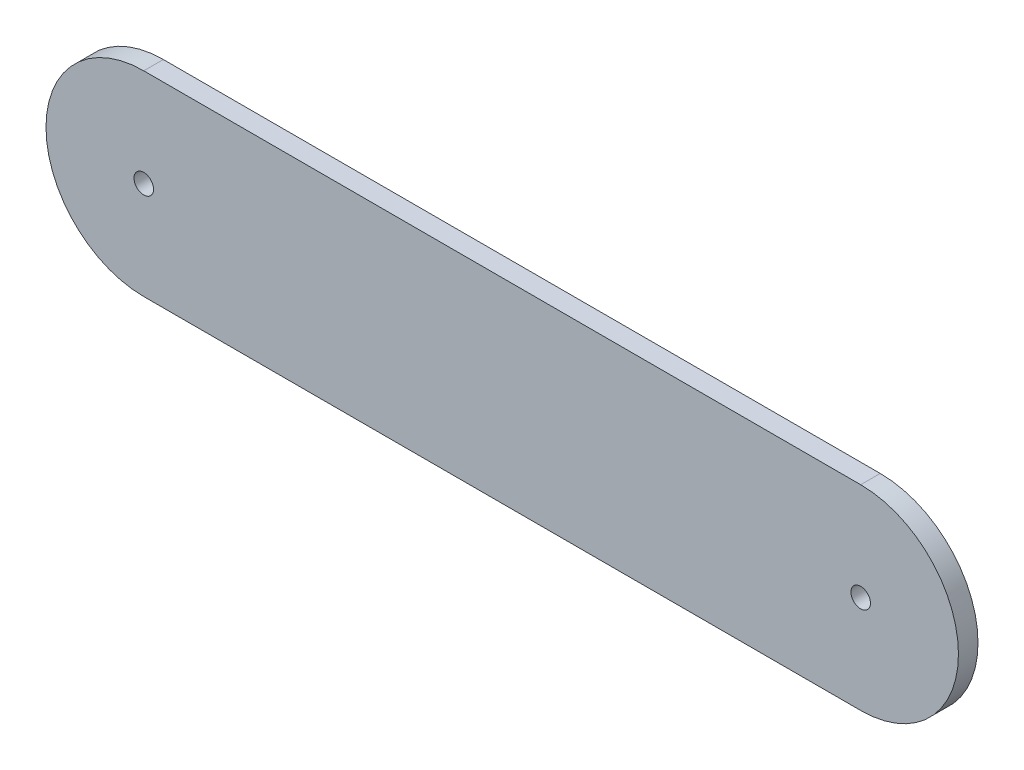
ISO-10303-21;
HEADER;
FILE_DESCRIPTION(('STEP AP214'),'2;1');
FILE_NAME('part.step','',(''),(''),'','','');
FILE_SCHEMA(('AUTOMOTIVE_DESIGN { 1 0 10303 214 1 1 1 1 }'));
ENDSEC;
DATA;
#1=APPLICATION_CONTEXT('core data for automotive mechanical design processes');
#2=APPLICATION_PROTOCOL_DEFINITION('international standard','automotive_design',2000,#1);
#3=PRODUCT_CONTEXT('',#1,'mechanical');
#4=PRODUCT('Part','Part','',(#3));
#5=PRODUCT_RELATED_PRODUCT_CATEGORY('part','',(#4));
#6=PRODUCT_DEFINITION_FORMATION('','',#4);
#7=PRODUCT_DEFINITION_CONTEXT('part definition',#1,'design');
#8=PRODUCT_DEFINITION('design','',#6,#7);
#9=PRODUCT_DEFINITION_SHAPE('','',#8);
#10=(LENGTH_UNIT() NAMED_UNIT(*) SI_UNIT(.MILLI.,.METRE.));
#11=(NAMED_UNIT(*) PLANE_ANGLE_UNIT() SI_UNIT($,.RADIAN.));
#12=(NAMED_UNIT(*) SI_UNIT($,.STERADIAN.) SOLID_ANGLE_UNIT());
#13=UNCERTAINTY_MEASURE_WITH_UNIT(LENGTH_MEASURE(1.E-05),#10,'distance_accuracy_value','');
#14=(GEOMETRIC_REPRESENTATION_CONTEXT(3) GLOBAL_UNCERTAINTY_ASSIGNED_CONTEXT((#13)) GLOBAL_UNIT_ASSIGNED_CONTEXT((#10,
#11,#12)) REPRESENTATION_CONTEXT('',''));
#15=CARTESIAN_POINT('',(0.,0.,0.));
#16=DIRECTION('',(0.,0.,1.));
#17=DIRECTION('',(1.,0.,0.));
#18=AXIS2_PLACEMENT_3D('',#15,#16,#17);
#19=CARTESIAN_POINT('',(-132.364555610785,14.7635383426485,3.));
#20=DIRECTION('',(0.,0.,1.));
#21=DIRECTION('',(1.,0.,0.));
#22=AXIS2_PLACEMENT_3D('',#19,#20,#21);
#23=PLANE('',#22);
#24=CARTESIAN_POINT('',(-22.3645556107846,14.7635383426485,3.));
#25=DIRECTION('',(0.,0.,1.));
#26=DIRECTION('',(1.,0.,0.));
#27=AXIS2_PLACEMENT_3D('',#24,#25,#26);
#28=CIRCLE('',#27,1.5);
#29=CARTESIAN_POINT('',(-20.8645556107846,14.7635383426485,3.));
#30=VERTEX_POINT('',#29);
#31=EDGE_CURVE('E104',#30,#30,#28,.T.);
#32=ORIENTED_EDGE('',*,*,#31,.F.);
#33=EDGE_LOOP('',(#32));
#34=FACE_BOUND('',#33,.T.);
#35=CARTESIAN_POINT('',(-132.364555610785,14.7635383426485,3.));
#36=DIRECTION('',(0.,0.,1.));
#37=DIRECTION('',(1.,0.,0.));
#38=AXIS2_PLACEMENT_3D('',#35,#36,#37);
#39=CIRCLE('',#38,15.);
#40=CARTESIAN_POINT('',(-132.364555610785,29.7635383426485,3.));
#41=VERTEX_POINT('',#40);
#42=CARTESIAN_POINT('',(-132.364555610785,-0.2364616573515,3.));
#43=VERTEX_POINT('',#42);
#44=EDGE_CURVE('E89',#41,#43,#39,.T.);
#45=ORIENTED_EDGE('',*,*,#44,.T.);
#46=DIRECTION('',(1.,0.,0.));
#47=VECTOR('',#46,1.);
#48=CARTESIAN_POINT('',(-22.3645556107846,-0.2364616573515,3.));
#49=LINE('',#48,#47);
#50=CARTESIAN_POINT('',(-22.3645556107846,-0.2364616573515,3.));
#51=VERTEX_POINT('',#50);
#52=EDGE_CURVE('E84',#43,#51,#49,.T.);
#53=ORIENTED_EDGE('',*,*,#52,.T.);
#54=CARTESIAN_POINT('',(-22.3645556107846,14.7635383426485,3.));
#55=DIRECTION('',(0.,0.,1.));
#56=DIRECTION('',(1.,0.,0.));
#57=AXIS2_PLACEMENT_3D('',#54,#55,#56);
#58=CIRCLE('',#57,15.);
#59=CARTESIAN_POINT('',(-22.3645556107846,29.7635383426485,3.));
#60=VERTEX_POINT('',#59);
#61=EDGE_CURVE('E87',#51,#60,#58,.T.);
#62=ORIENTED_EDGE('',*,*,#61,.T.);
#63=DIRECTION('',(-1.,0.,0.));
#64=VECTOR('',#63,1.);
#65=CARTESIAN_POINT('',(-132.364555610785,29.7635383426485,3.));
#66=LINE('',#65,#64);
#67=EDGE_CURVE('E54',#60,#41,#66,.T.);
#68=ORIENTED_EDGE('',*,*,#67,.T.);
#69=EDGE_LOOP('',(#45,#53,#62,#68));
#70=FACE_BOUND('',#69,.T.);
#71=CARTESIAN_POINT('',(-132.364555610785,14.7635383426485,3.));
#72=DIRECTION('',(0.,0.,1.));
#73=DIRECTION('',(1.,0.,0.));
#74=AXIS2_PLACEMENT_3D('',#71,#72,#73);
#75=CIRCLE('',#74,1.5);
#76=CARTESIAN_POINT('',(-130.864555610785,14.7635383426485,3.));
#77=VERTEX_POINT('',#76);
#78=EDGE_CURVE('E119',#77,#77,#75,.T.);
#79=ORIENTED_EDGE('',*,*,#78,.F.);
#80=EDGE_LOOP('',(#79));
#81=FACE_BOUND('',#80,.T.);
#82=ADVANCED_FACE('F37',(#34,#70,#81),#23,.T.);
#83=CARTESIAN_POINT('',(-132.364555610785,14.7635383426485,0.));
#84=DIRECTION('',(0.,0.,1.));
#85=DIRECTION('',(1.,0.,0.));
#86=AXIS2_PLACEMENT_3D('',#83,#84,#85);
#87=PLANE('',#86);
#88=CARTESIAN_POINT('',(-22.3645556107846,14.7635383426485,0.));
#89=DIRECTION('',(0.,0.,1.));
#90=DIRECTION('',(1.,0.,0.));
#91=AXIS2_PLACEMENT_3D('',#88,#89,#90);
#92=CIRCLE('',#91,1.5);
#93=CARTESIAN_POINT('',(-20.8645556107846,14.7635383426485,0.));
#94=VERTEX_POINT('',#93);
#95=EDGE_CURVE('E116',#94,#94,#92,.T.);
#96=ORIENTED_EDGE('',*,*,#95,.T.);
#97=EDGE_LOOP('',(#96));
#98=FACE_BOUND('',#97,.T.);
#99=CARTESIAN_POINT('',(-132.364555610785,14.7635383426485,0.));
#100=DIRECTION('',(0.,0.,1.));
#101=DIRECTION('',(1.,0.,0.));
#102=AXIS2_PLACEMENT_3D('',#99,#100,#101);
#103=CIRCLE('',#102,15.);
#104=CARTESIAN_POINT('',(-132.364555610785,29.7635383426485,0.));
#105=VERTEX_POINT('',#104);
#106=CARTESIAN_POINT('',(-132.364555610785,-0.2364616573515,0.));
#107=VERTEX_POINT('',#106);
#108=EDGE_CURVE('E101',#105,#107,#103,.T.);
#109=ORIENTED_EDGE('',*,*,#108,.F.);
#110=DIRECTION('',(-1.,0.,0.));
#111=VECTOR('',#110,1.);
#112=CARTESIAN_POINT('',(-132.364555610785,29.7635383426485,0.));
#113=LINE('',#112,#111);
#114=CARTESIAN_POINT('',(-22.3645556107846,29.7635383426485,0.));
#115=VERTEX_POINT('',#114);
#116=EDGE_CURVE('E77',#115,#105,#113,.T.);
#117=ORIENTED_EDGE('',*,*,#116,.F.);
#118=CARTESIAN_POINT('',(-22.3645556107846,14.7635383426485,0.));
#119=DIRECTION('',(0.,0.,1.));
#120=DIRECTION('',(1.,0.,0.));
#121=AXIS2_PLACEMENT_3D('',#118,#119,#120);
#122=CIRCLE('',#121,15.);
#123=CARTESIAN_POINT('',(-22.3645556107846,-0.2364616573515,0.));
#124=VERTEX_POINT('',#123);
#125=EDGE_CURVE('E71',#124,#115,#122,.T.);
#126=ORIENTED_EDGE('',*,*,#125,.F.);
#127=DIRECTION('',(1.,0.,0.));
#128=VECTOR('',#127,1.);
#129=CARTESIAN_POINT('',(-22.3645556107846,-0.2364616573515,0.));
#130=LINE('',#129,#128);
#131=EDGE_CURVE('E93',#107,#124,#130,.T.);
#132=ORIENTED_EDGE('',*,*,#131,.F.);
#133=EDGE_LOOP('',(#109,#117,#126,#132));
#134=FACE_BOUND('',#133,.T.);
#135=CARTESIAN_POINT('',(-132.364555610785,14.7635383426485,0.));
#136=DIRECTION('',(0.,0.,1.));
#137=DIRECTION('',(1.,0.,0.));
#138=AXIS2_PLACEMENT_3D('',#135,#136,#137);
#139=CIRCLE('',#138,1.5);
#140=CARTESIAN_POINT('',(-130.864555610785,14.7635383426485,0.));
#141=VERTEX_POINT('',#140);
#142=EDGE_CURVE('E122',#141,#141,#139,.T.);
#143=ORIENTED_EDGE('',*,*,#142,.T.);
#144=EDGE_LOOP('',(#143));
#145=FACE_BOUND('',#144,.T.);
#146=ADVANCED_FACE('F112',(#98,#134,#145),#87,.F.);
#147=CARTESIAN_POINT('',(-132.364555610785,14.7635383426485,3.));
#148=DIRECTION('',(0.,0.,-1.));
#149=DIRECTION('',(-1.,0.,0.));
#150=AXIS2_PLACEMENT_3D('',#147,#148,#149);
#151=CYLINDRICAL_SURFACE('',#150,15.);
#152=ORIENTED_EDGE('',*,*,#108,.T.);
#153=DIRECTION('',(0.,0.,-1.));
#154=VECTOR('',#153,1.);
#155=CARTESIAN_POINT('',(-132.364555610785,-0.2364616573515,3.));
#156=LINE('',#155,#154);
#157=EDGE_CURVE('E11',#43,#107,#156,.T.);
#158=ORIENTED_EDGE('',*,*,#157,.F.);
#159=ORIENTED_EDGE('',*,*,#44,.F.);
#160=DIRECTION('',(0.,0.,-1.));
#161=VECTOR('',#160,1.);
#162=CARTESIAN_POINT('',(-132.364555610785,29.7635383426485,3.));
#163=LINE('',#162,#161);
#164=EDGE_CURVE('E97',#41,#105,#163,.T.);
#165=ORIENTED_EDGE('',*,*,#164,.T.);
#166=EDGE_LOOP('',(#152,#158,#159,#165));
#167=FACE_BOUND('',#166,.T.);
#168=ADVANCED_FACE('F39',(#167),#151,.T.);
#169=CARTESIAN_POINT('',(-22.3645556107846,-0.2364616573515,3.));
#170=DIRECTION('',(0.,1.,0.));
#171=DIRECTION('',(0.,0.,1.));
#172=AXIS2_PLACEMENT_3D('',#169,#170,#171);
#173=PLANE('',#172);
#174=ORIENTED_EDGE('',*,*,#131,.T.);
#175=DIRECTION('',(0.,0.,-1.));
#176=VECTOR('',#175,1.);
#177=CARTESIAN_POINT('',(-22.3645556107846,-0.2364616573515,3.));
#178=LINE('',#177,#176);
#179=EDGE_CURVE('E46',#51,#124,#178,.T.);
#180=ORIENTED_EDGE('',*,*,#179,.F.);
#181=ORIENTED_EDGE('',*,*,#52,.F.);
#182=ORIENTED_EDGE('',*,*,#157,.T.);
#183=EDGE_LOOP('',(#174,#180,#181,#182));
#184=FACE_BOUND('',#183,.T.);
#185=ADVANCED_FACE('F92',(#184),#173,.F.);
#186=CARTESIAN_POINT('',(-22.3645556107846,14.7635383426485,3.));
#187=DIRECTION('',(0.,0.,-1.));
#188=DIRECTION('',(-1.,0.,0.));
#189=AXIS2_PLACEMENT_3D('',#186,#187,#188);
#190=CYLINDRICAL_SURFACE('',#189,15.);
#191=ORIENTED_EDGE('',*,*,#125,.T.);
#192=DIRECTION('',(0.,0.,-1.));
#193=VECTOR('',#192,1.);
#194=CARTESIAN_POINT('',(-22.3645556107846,29.7635383426485,3.));
#195=LINE('',#194,#193);
#196=EDGE_CURVE('E94',#60,#115,#195,.T.);
#197=ORIENTED_EDGE('',*,*,#196,.F.);
#198=ORIENTED_EDGE('',*,*,#61,.F.);
#199=ORIENTED_EDGE('',*,*,#179,.T.);
#200=EDGE_LOOP('',(#191,#197,#198,#199));
#201=FACE_BOUND('',#200,.T.);
#202=ADVANCED_FACE('F95',(#201),#190,.T.);
#203=CARTESIAN_POINT('',(-132.364555610785,29.7635383426485,3.));
#204=DIRECTION('',(0.,-1.,0.));
#205=DIRECTION('',(0.,0.,-1.));
#206=AXIS2_PLACEMENT_3D('',#203,#204,#205);
#207=PLANE('',#206);
#208=ORIENTED_EDGE('',*,*,#116,.T.);
#209=ORIENTED_EDGE('',*,*,#164,.F.);
#210=ORIENTED_EDGE('',*,*,#67,.F.);
#211=ORIENTED_EDGE('',*,*,#196,.T.);
#212=EDGE_LOOP('',(#208,#209,#210,#211));
#213=FACE_BOUND('',#212,.T.);
#214=ADVANCED_FACE('F109',(#213),#207,.F.);
#215=CARTESIAN_POINT('',(-22.3645556107846,14.7635383426485,3.));
#216=DIRECTION('',(0.,0.,-1.));
#217=DIRECTION('',(-1.,0.,0.));
#218=AXIS2_PLACEMENT_3D('',#215,#216,#217);
#219=CYLINDRICAL_SURFACE('',#218,1.5);
#220=ORIENTED_EDGE('',*,*,#31,.T.);
#221=EDGE_LOOP('',(#220));
#222=FACE_BOUND('',#221,.T.);
#223=ORIENTED_EDGE('',*,*,#95,.F.);
#224=EDGE_LOOP('',(#223));
#225=FACE_BOUND('',#224,.T.);
#226=ADVANCED_FACE('F140',(#222,#225),#219,.F.);
#227=CARTESIAN_POINT('',(-132.364555610785,14.7635383426485,3.));
#228=DIRECTION('',(0.,0.,-1.));
#229=DIRECTION('',(-1.,0.,0.));
#230=AXIS2_PLACEMENT_3D('',#227,#228,#229);
#231=CYLINDRICAL_SURFACE('',#230,1.5);
#232=ORIENTED_EDGE('',*,*,#78,.T.);
#233=EDGE_LOOP('',(#232));
#234=FACE_BOUND('',#233,.T.);
#235=ORIENTED_EDGE('',*,*,#142,.F.);
#236=EDGE_LOOP('',(#235));
#237=FACE_BOUND('',#236,.T.);
#238=ADVANCED_FACE('F128',(#234,#237),#231,.F.);
#239=CLOSED_SHELL('',(#82,#146,#168,#185,#202,#214,#226,#238));
#240=MANIFOLD_SOLID_BREP('B2',#239);
#241=ADVANCED_BREP_SHAPE_REPRESENTATION('',(#18,#240),#14);
#242=SHAPE_DEFINITION_REPRESENTATION(#9,#241);
ENDSEC;
END-ISO-10303-21;
